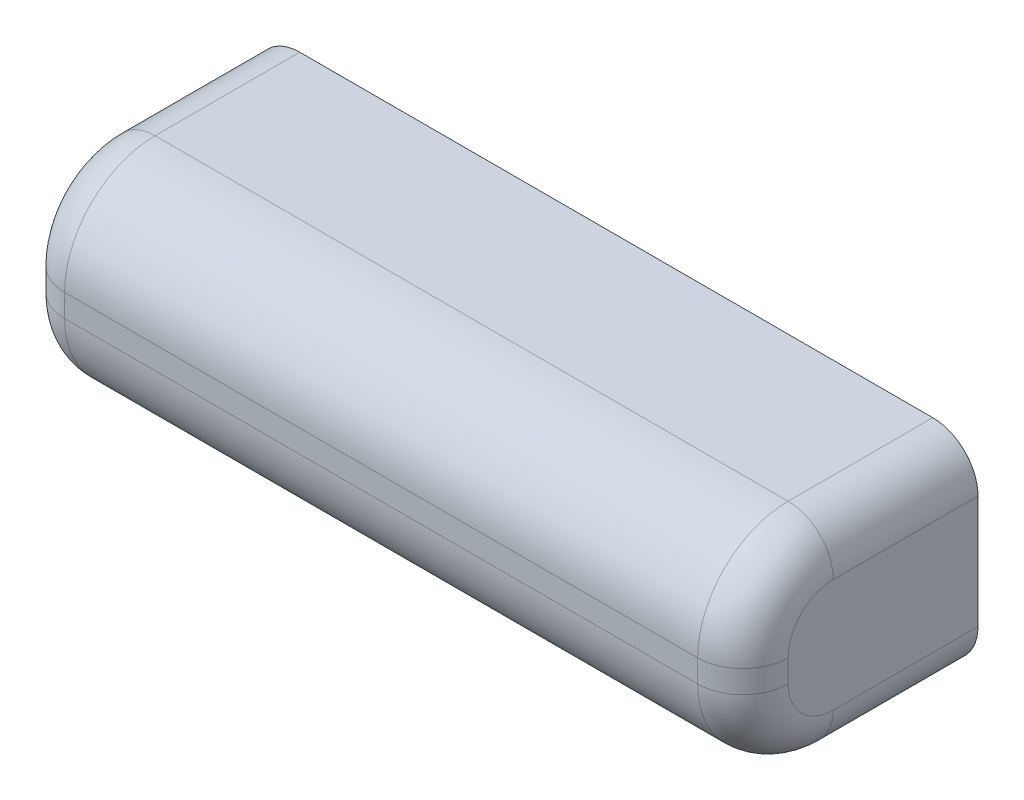
ISO-10303-21;
HEADER;
FILE_DESCRIPTION(('STEP AP214'),'2;1');
FILE_NAME('part.step','',(''),(''),'','','');
FILE_SCHEMA(('AUTOMOTIVE_DESIGN { 1 0 10303 214 1 1 1 1 }'));
ENDSEC;
DATA;
#1=APPLICATION_CONTEXT('core data for automotive mechanical design processes');
#2=APPLICATION_PROTOCOL_DEFINITION('international standard','automotive_design',2000,#1);
#3=PRODUCT_CONTEXT('',#1,'mechanical');
#4=PRODUCT('Part','Part','',(#3));
#5=PRODUCT_RELATED_PRODUCT_CATEGORY('part','',(#4));
#6=PRODUCT_DEFINITION_FORMATION('','',#4);
#7=PRODUCT_DEFINITION_CONTEXT('part definition',#1,'design');
#8=PRODUCT_DEFINITION('design','',#6,#7);
#9=PRODUCT_DEFINITION_SHAPE('','',#8);
#10=(LENGTH_UNIT() NAMED_UNIT(*) SI_UNIT(.MILLI.,.METRE.));
#11=(NAMED_UNIT(*) PLANE_ANGLE_UNIT() SI_UNIT($,.RADIAN.));
#12=(NAMED_UNIT(*) SI_UNIT($,.STERADIAN.) SOLID_ANGLE_UNIT());
#13=UNCERTAINTY_MEASURE_WITH_UNIT(LENGTH_MEASURE(1.E-05),#10,'distance_accuracy_value','');
#14=(GEOMETRIC_REPRESENTATION_CONTEXT(3) GLOBAL_UNCERTAINTY_ASSIGNED_CONTEXT((#13)) GLOBAL_UNIT_ASSIGNED_CONTEXT((#10,
#11,#12)) REPRESENTATION_CONTEXT('',''));
#15=CARTESIAN_POINT('',(0.,0.,0.));
#16=DIRECTION('',(0.,0.,1.));
#17=DIRECTION('',(1.,0.,0.));
#18=AXIS2_PLACEMENT_3D('',#15,#16,#17);
#19=CARTESIAN_POINT('',(64.,0.,10.));
#20=DIRECTION('',(0.,0.,-1.));
#21=DIRECTION('',(-1.,0.,0.));
#22=AXIS2_PLACEMENT_3D('',#19,#20,#21);
#23=PLANE('',#22);
#24=CARTESIAN_POINT('',(64.,0.,10.));
#25=DIRECTION('',(0.,0.,-1.));
#26=DIRECTION('',(-1.,0.,0.));
#27=AXIS2_PLACEMENT_3D('',#24,#25,#26);
#28=CIRCLE('',#27,15.);
#29=CARTESIAN_POINT('',(49.,0.,10.));
#30=VERTEX_POINT('',#29);
#31=EDGE_CURVE('E238',#30,#30,#28,.T.);
#32=ORIENTED_EDGE('',*,*,#31,.T.);
#33=EDGE_LOOP('',(#32));
#34=FACE_BOUND('',#33,.T.);
#35=ADVANCED_FACE('F38',(#34),#23,.T.);
#36=CARTESIAN_POINT('',(64.,0.,10.));
#37=DIRECTION('',(0.,0.,-1.));
#38=DIRECTION('',(-1.,0.,0.));
#39=AXIS2_PLACEMENT_3D('',#36,#37,#38);
#40=CYLINDRICAL_SURFACE('',#39,15.);
#41=ORIENTED_EDGE('',*,*,#31,.F.);
#42=EDGE_LOOP('',(#41));
#43=FACE_BOUND('',#42,.T.);
#44=CARTESIAN_POINT('',(64.,0.,0.));
#45=DIRECTION('',(0.,0.,-1.));
#46=DIRECTION('',(-1.,0.,0.));
#47=AXIS2_PLACEMENT_3D('',#44,#45,#46);
#48=CIRCLE('',#47,15.);
#49=CARTESIAN_POINT('',(49.,0.,0.));
#50=VERTEX_POINT('',#49);
#51=EDGE_CURVE('E235',#50,#50,#48,.T.);
#52=ORIENTED_EDGE('',*,*,#51,.T.);
#53=EDGE_LOOP('',(#52));
#54=FACE_BOUND('',#53,.T.);
#55=ADVANCED_FACE('F314',(#43,#54),#40,.F.);
#56=CARTESIAN_POINT('',(-64.,0.,10.));
#57=DIRECTION('',(0.,0.,-1.));
#58=DIRECTION('',(-1.,0.,0.));
#59=AXIS2_PLACEMENT_3D('',#56,#57,#58);
#60=PLANE('',#59);
#61=CARTESIAN_POINT('',(-64.,0.,10.));
#62=DIRECTION('',(0.,0.,-1.));
#63=DIRECTION('',(-1.,0.,0.));
#64=AXIS2_PLACEMENT_3D('',#61,#62,#63);
#65=CIRCLE('',#64,15.);
#66=CARTESIAN_POINT('',(-79.,0.,10.));
#67=VERTEX_POINT('',#66);
#68=EDGE_CURVE('E232',#67,#67,#65,.T.);
#69=ORIENTED_EDGE('',*,*,#68,.T.);
#70=EDGE_LOOP('',(#69));
#71=FACE_BOUND('',#70,.T.);
#72=ADVANCED_FACE('F320',(#71),#60,.T.);
#73=CARTESIAN_POINT('',(-64.,0.,10.));
#74=DIRECTION('',(0.,0.,-1.));
#75=DIRECTION('',(-1.,0.,0.));
#76=AXIS2_PLACEMENT_3D('',#73,#74,#75);
#77=CYLINDRICAL_SURFACE('',#76,15.);
#78=ORIENTED_EDGE('',*,*,#68,.F.);
#79=EDGE_LOOP('',(#78));
#80=FACE_BOUND('',#79,.T.);
#81=CARTESIAN_POINT('',(-64.,0.,0.));
#82=DIRECTION('',(0.,0.,-1.));
#83=DIRECTION('',(-1.,0.,0.));
#84=AXIS2_PLACEMENT_3D('',#81,#82,#83);
#85=CIRCLE('',#84,15.);
#86=CARTESIAN_POINT('',(-79.,0.,0.));
#87=VERTEX_POINT('',#86);
#88=EDGE_CURVE('E229',#87,#87,#85,.T.);
#89=ORIENTED_EDGE('',*,*,#88,.T.);
#90=EDGE_LOOP('',(#89));
#91=FACE_BOUND('',#90,.T.);
#92=ADVANCED_FACE('F479',(#80,#91),#77,.F.);
#93=CARTESIAN_POINT('',(80.,22.5,52.));
#94=DIRECTION('',(-1.,0.,0.));
#95=DIRECTION('',(0.,-1.,0.));
#96=AXIS2_PLACEMENT_3D('',#93,#94,#95);
#97=PLANE('',#96);
#98=CARTESIAN_POINT('',(80.,-2.50000000000002,32.));
#99=DIRECTION('',(-1.,0.,0.));
#100=DIRECTION('',(0.,-1.,0.));
#101=AXIS2_PLACEMENT_3D('',#98,#99,#100);
#102=CIRCLE('',#101,10.);
#103=CARTESIAN_POINT('',(80.,-2.50000000000002,42.));
#104=VERTEX_POINT('',#103);
#105=CARTESIAN_POINT('',(80.,-12.5,32.));
#106=VERTEX_POINT('',#105);
#107=EDGE_CURVE('E55',#104,#106,#102,.F.);
#108=ORIENTED_EDGE('',*,*,#107,.T.);
#109=DIRECTION('',(0.,0.,-1.));
#110=VECTOR('',#109,1.);
#111=CARTESIAN_POINT('',(80.,-12.5,52.));
#112=LINE('',#111,#110);
#113=CARTESIAN_POINT('',(80.,-12.5,0.));
#114=VERTEX_POINT('',#113);
#115=EDGE_CURVE('E161',#106,#114,#112,.T.);
#116=ORIENTED_EDGE('',*,*,#115,.T.);
#117=DIRECTION('',(0.,1.,0.));
#118=VECTOR('',#117,1.);
#119=CARTESIAN_POINT('',(80.,22.5,0.));
#120=LINE('',#119,#118);
#121=CARTESIAN_POINT('',(80.,12.5,0.));
#122=VERTEX_POINT('',#121);
#123=EDGE_CURVE('E217',#114,#122,#120,.T.);
#124=ORIENTED_EDGE('',*,*,#123,.T.);
#125=DIRECTION('',(0.,0.,-1.));
#126=VECTOR('',#125,1.);
#127=CARTESIAN_POINT('',(80.,12.5,52.));
#128=LINE('',#127,#126);
#129=CARTESIAN_POINT('',(80.,12.5,32.));
#130=VERTEX_POINT('',#129);
#131=EDGE_CURVE('E274',#122,#130,#128,.F.);
#132=ORIENTED_EDGE('',*,*,#131,.T.);
#133=CARTESIAN_POINT('',(80.,2.49999999999999,32.));
#134=DIRECTION('',(-1.,0.,0.));
#135=DIRECTION('',(0.,-1.,0.));
#136=AXIS2_PLACEMENT_3D('',#133,#134,#135);
#137=CIRCLE('',#136,10.);
#138=CARTESIAN_POINT('',(80.,2.49999999999999,42.));
#139=VERTEX_POINT('',#138);
#140=EDGE_CURVE('E276',#130,#139,#137,.F.);
#141=ORIENTED_EDGE('',*,*,#140,.T.);
#142=DIRECTION('',(0.,1.,0.));
#143=VECTOR('',#142,1.);
#144=CARTESIAN_POINT('',(80.,-2.50000000000001,42.));
#145=LINE('',#144,#143);
#146=EDGE_CURVE('E60',#139,#104,#145,.F.);
#147=ORIENTED_EDGE('',*,*,#146,.T.);
#148=EDGE_LOOP('',(#108,#116,#124,#132,#141,#147));
#149=FACE_BOUND('',#148,.T.);
#150=ADVANCED_FACE('F295',(#149),#97,.F.);
#151=CARTESIAN_POINT('',(-80.,22.5,52.));
#152=DIRECTION('',(0.,-1.,0.));
#153=DIRECTION('',(0.,0.,-1.));
#154=AXIS2_PLACEMENT_3D('',#151,#152,#153);
#155=PLANE('',#154);
#156=DIRECTION('',(-1.,0.,0.));
#157=VECTOR('',#156,1.);
#158=CARTESIAN_POINT('',(-80.,22.5,0.));
#159=LINE('',#158,#157);
#160=CARTESIAN_POINT('',(70.,22.5,0.));
#161=VERTEX_POINT('',#160);
#162=CARTESIAN_POINT('',(-70.,22.5,0.));
#163=VERTEX_POINT('',#162);
#164=EDGE_CURVE('E222',#161,#163,#159,.T.);
#165=ORIENTED_EDGE('',*,*,#164,.T.);
#166=DIRECTION('',(0.,0.,-1.));
#167=VECTOR('',#166,1.);
#168=CARTESIAN_POINT('',(-70.,22.5,52.));
#169=LINE('',#168,#167);
#170=CARTESIAN_POINT('',(-70.,22.5,32.));
#171=VERTEX_POINT('',#170);
#172=EDGE_CURVE('E11',#163,#171,#169,.F.);
#173=ORIENTED_EDGE('',*,*,#172,.T.);
#174=DIRECTION('',(-1.,0.,0.));
#175=VECTOR('',#174,1.);
#176=CARTESIAN_POINT('',(80.,22.5,32.));
#177=LINE('',#176,#175);
#178=CARTESIAN_POINT('',(70.,22.5,32.));
#179=VERTEX_POINT('',#178);
#180=EDGE_CURVE('E140',#171,#179,#177,.F.);
#181=ORIENTED_EDGE('',*,*,#180,.T.);
#182=DIRECTION('',(0.,0.,-1.));
#183=VECTOR('',#182,1.);
#184=CARTESIAN_POINT('',(70.,22.5,52.));
#185=LINE('',#184,#183);
#186=EDGE_CURVE('E47',#179,#161,#185,.T.);
#187=ORIENTED_EDGE('',*,*,#186,.T.);
#188=EDGE_LOOP('',(#165,#173,#181,#187));
#189=FACE_BOUND('',#188,.T.);
#190=ADVANCED_FACE('F283',(#189),#155,.F.);
#191=CARTESIAN_POINT('',(-80.,22.5,52.));
#192=DIRECTION('',(1.,0.,0.));
#193=DIRECTION('',(0.,0.,-1.));
#194=AXIS2_PLACEMENT_3D('',#191,#192,#193);
#195=PLANE('',#194);
#196=DIRECTION('',(0.,-1.,0.));
#197=VECTOR('',#196,1.);
#198=CARTESIAN_POINT('',(-80.,22.5,0.));
#199=LINE('',#198,#197);
#200=CARTESIAN_POINT('',(-80.,12.5,0.));
#201=VERTEX_POINT('',#200);
#202=CARTESIAN_POINT('',(-80.,-12.5,0.));
#203=VERTEX_POINT('',#202);
#204=EDGE_CURVE('E225',#201,#203,#199,.T.);
#205=ORIENTED_EDGE('',*,*,#204,.T.);
#206=DIRECTION('',(0.,0.,-1.));
#207=VECTOR('',#206,1.);
#208=CARTESIAN_POINT('',(-80.,-12.5,52.));
#209=LINE('',#208,#207);
#210=CARTESIAN_POINT('',(-80.,-12.5,32.));
#211=VERTEX_POINT('',#210);
#212=EDGE_CURVE('E158',#203,#211,#209,.F.);
#213=ORIENTED_EDGE('',*,*,#212,.T.);
#214=CARTESIAN_POINT('',(-80.,-2.50000000000001,32.));
#215=DIRECTION('',(1.,0.,0.));
#216=DIRECTION('',(0.,0.,-1.));
#217=AXIS2_PLACEMENT_3D('',#214,#215,#216);
#218=CIRCLE('',#217,10.);
#219=CARTESIAN_POINT('',(-80.,-2.50000000000001,42.));
#220=VERTEX_POINT('',#219);
#221=EDGE_CURVE('E262',#211,#220,#218,.F.);
#222=ORIENTED_EDGE('',*,*,#221,.T.);
#223=DIRECTION('',(0.,-1.,0.));
#224=VECTOR('',#223,1.);
#225=CARTESIAN_POINT('',(-80.,2.50000000000001,42.));
#226=LINE('',#225,#224);
#227=CARTESIAN_POINT('',(-80.,2.5,42.));
#228=VERTEX_POINT('',#227);
#229=EDGE_CURVE('E260',#220,#228,#226,.F.);
#230=ORIENTED_EDGE('',*,*,#229,.T.);
#231=CARTESIAN_POINT('',(-80.,2.5,32.));
#232=DIRECTION('',(1.,0.,0.));
#233=DIRECTION('',(0.,0.,-1.));
#234=AXIS2_PLACEMENT_3D('',#231,#232,#233);
#235=CIRCLE('',#234,10.);
#236=CARTESIAN_POINT('',(-80.,12.5,32.));
#237=VERTEX_POINT('',#236);
#238=EDGE_CURVE('E258',#228,#237,#235,.F.);
#239=ORIENTED_EDGE('',*,*,#238,.T.);
#240=DIRECTION('',(0.,0.,-1.));
#241=VECTOR('',#240,1.);
#242=CARTESIAN_POINT('',(-80.,12.5,52.));
#243=LINE('',#242,#241);
#244=EDGE_CURVE('E256',#237,#201,#243,.T.);
#245=ORIENTED_EDGE('',*,*,#244,.T.);
#246=EDGE_LOOP('',(#205,#213,#222,#230,#239,#245));
#247=FACE_BOUND('',#246,.T.);
#248=ADVANCED_FACE('F297',(#247),#195,.F.);
#249=CARTESIAN_POINT('',(-80.,-22.5,52.));
#250=DIRECTION('',(0.,1.,0.));
#251=DIRECTION('',(0.,0.,1.));
#252=AXIS2_PLACEMENT_3D('',#249,#250,#251);
#253=PLANE('',#252);
#254=DIRECTION('',(1.,0.,0.));
#255=VECTOR('',#254,1.);
#256=CARTESIAN_POINT('',(-80.,-22.5,32.));
#257=LINE('',#256,#255);
#258=CARTESIAN_POINT('',(70.,-22.5,32.));
#259=VERTEX_POINT('',#258);
#260=CARTESIAN_POINT('',(-70.,-22.5,32.));
#261=VERTEX_POINT('',#260);
#262=EDGE_CURVE('E133',#259,#261,#257,.F.);
#263=ORIENTED_EDGE('',*,*,#262,.T.);
#264=DIRECTION('',(0.,0.,-1.));
#265=VECTOR('',#264,1.);
#266=CARTESIAN_POINT('',(-70.,-22.5,52.));
#267=LINE('',#266,#265);
#268=CARTESIAN_POINT('',(-70.,-22.5,0.));
#269=VERTEX_POINT('',#268);
#270=EDGE_CURVE('E139',#261,#269,#267,.T.);
#271=ORIENTED_EDGE('',*,*,#270,.T.);
#272=DIRECTION('',(1.,0.,0.));
#273=VECTOR('',#272,1.);
#274=CARTESIAN_POINT('',(-80.,-22.5,0.));
#275=LINE('',#274,#273);
#276=CARTESIAN_POINT('',(70.,-22.5,0.));
#277=VERTEX_POINT('',#276);
#278=EDGE_CURVE('E136',#269,#277,#275,.T.);
#279=ORIENTED_EDGE('',*,*,#278,.T.);
#280=DIRECTION('',(0.,0.,-1.));
#281=VECTOR('',#280,1.);
#282=CARTESIAN_POINT('',(70.,-22.5,52.));
#283=LINE('',#282,#281);
#284=EDGE_CURVE('E129',#277,#259,#283,.F.);
#285=ORIENTED_EDGE('',*,*,#284,.T.);
#286=EDGE_LOOP('',(#263,#271,#279,#285));
#287=FACE_BOUND('',#286,.T.);
#288=ADVANCED_FACE('F131',(#287),#253,.F.);
#289=CARTESIAN_POINT('',(0.,0.,52.));
#290=DIRECTION('',(0.,0.,1.));
#291=DIRECTION('',(1.,0.,0.));
#292=AXIS2_PLACEMENT_3D('',#289,#290,#291);
#293=PLANE('',#292);
#294=DIRECTION('',(-1.,0.,0.));
#295=VECTOR('',#294,1.);
#296=CARTESIAN_POINT('',(-80.,2.5,52.));
#297=LINE('',#296,#295);
#298=CARTESIAN_POINT('',(70.,2.5,52.));
#299=VERTEX_POINT('',#298);
#300=CARTESIAN_POINT('',(-70.,2.5,52.));
#301=VERTEX_POINT('',#300);
#302=EDGE_CURVE('E241',#299,#301,#297,.T.);
#303=ORIENTED_EDGE('',*,*,#302,.T.);
#304=DIRECTION('',(0.,-1.,0.));
#305=VECTOR('',#304,1.);
#306=CARTESIAN_POINT('',(-70.,-2.50000000000001,52.));
#307=LINE('',#306,#305);
#308=CARTESIAN_POINT('',(-70.,-2.50000000000001,52.));
#309=VERTEX_POINT('',#308);
#310=EDGE_CURVE('E268',#301,#309,#307,.T.);
#311=ORIENTED_EDGE('',*,*,#310,.T.);
#312=DIRECTION('',(1.,0.,0.));
#313=VECTOR('',#312,1.);
#314=CARTESIAN_POINT('',(80.,-2.50000000000001,52.));
#315=LINE('',#314,#313);
#316=CARTESIAN_POINT('',(70.,-2.50000000000001,52.));
#317=VERTEX_POINT('',#316);
#318=EDGE_CURVE('E150',#309,#317,#315,.T.);
#319=ORIENTED_EDGE('',*,*,#318,.T.);
#320=DIRECTION('',(0.,1.,0.));
#321=VECTOR('',#320,1.);
#322=CARTESIAN_POINT('',(70.,2.50000000000001,52.));
#323=LINE('',#322,#321);
#324=EDGE_CURVE('E266',#317,#299,#323,.T.);
#325=ORIENTED_EDGE('',*,*,#324,.T.);
#326=EDGE_LOOP('',(#303,#311,#319,#325));
#327=FACE_BOUND('',#326,.T.);
#328=ADVANCED_FACE('F340',(#327),#293,.T.);
#329=CARTESIAN_POINT('',(0.,0.,0.));
#330=DIRECTION('',(0.,0.,1.));
#331=DIRECTION('',(1.,0.,0.));
#332=AXIS2_PLACEMENT_3D('',#329,#330,#331);
#333=PLANE('',#332);
#334=CARTESIAN_POINT('',(32.,0.,0.));
#335=DIRECTION('',(0.,0.,-1.));
#336=DIRECTION('',(-1.,0.,0.));
#337=AXIS2_PLACEMENT_3D('',#334,#335,#336);
#338=CIRCLE('',#337,15.);
#339=CARTESIAN_POINT('',(17.,0.,0.));
#340=VERTEX_POINT('',#339);
#341=EDGE_CURVE('E194',#340,#340,#338,.T.);
#342=ORIENTED_EDGE('',*,*,#341,.F.);
#343=EDGE_LOOP('',(#342));
#344=FACE_BOUND('',#343,.T.);
#345=CARTESIAN_POINT('',(-32.,0.,0.));
#346=DIRECTION('',(0.,0.,-1.));
#347=DIRECTION('',(-1.,0.,0.));
#348=AXIS2_PLACEMENT_3D('',#345,#346,#347);
#349=CIRCLE('',#348,15.);
#350=CARTESIAN_POINT('',(-47.,0.,0.));
#351=VERTEX_POINT('',#350);
#352=EDGE_CURVE('E205',#351,#351,#349,.T.);
#353=ORIENTED_EDGE('',*,*,#352,.F.);
#354=EDGE_LOOP('',(#353));
#355=FACE_BOUND('',#354,.T.);
#356=CARTESIAN_POINT('',(0.,0.,0.));
#357=DIRECTION('',(0.,0.,-1.));
#358=DIRECTION('',(-1.,0.,0.));
#359=AXIS2_PLACEMENT_3D('',#356,#357,#358);
#360=CIRCLE('',#359,15.);
#361=CARTESIAN_POINT('',(-15.,0.,0.));
#362=VERTEX_POINT('',#361);
#363=EDGE_CURVE('E213',#362,#362,#360,.T.);
#364=ORIENTED_EDGE('',*,*,#363,.F.);
#365=EDGE_LOOP('',(#364));
#366=FACE_BOUND('',#365,.T.);
#367=ORIENTED_EDGE('',*,*,#278,.F.);
#368=CARTESIAN_POINT('',(-70.,-12.5,0.));
#369=DIRECTION('',(0.,0.,1.));
#370=DIRECTION('',(1.,0.,0.));
#371=AXIS2_PLACEMENT_3D('',#368,#369,#370);
#372=CIRCLE('',#371,10.);
#373=EDGE_CURVE('E254',#269,#203,#372,.F.);
#374=ORIENTED_EDGE('',*,*,#373,.T.);
#375=ORIENTED_EDGE('',*,*,#204,.F.);
#376=CARTESIAN_POINT('',(-70.,12.5,0.));
#377=DIRECTION('',(0.,0.,1.));
#378=DIRECTION('',(1.,0.,0.));
#379=AXIS2_PLACEMENT_3D('',#376,#377,#378);
#380=CIRCLE('',#379,10.);
#381=EDGE_CURVE('E250',#201,#163,#380,.F.);
#382=ORIENTED_EDGE('',*,*,#381,.T.);
#383=ORIENTED_EDGE('',*,*,#164,.F.);
#384=CARTESIAN_POINT('',(70.,12.5,0.));
#385=DIRECTION('',(0.,0.,1.));
#386=DIRECTION('',(1.,0.,0.));
#387=AXIS2_PLACEMENT_3D('',#384,#385,#386);
#388=CIRCLE('',#387,10.);
#389=EDGE_CURVE('E248',#161,#122,#388,.F.);
#390=ORIENTED_EDGE('',*,*,#389,.T.);
#391=ORIENTED_EDGE('',*,*,#123,.F.);
#392=CARTESIAN_POINT('',(70.,-12.5,0.));
#393=DIRECTION('',(0.,0.,1.));
#394=DIRECTION('',(1.,0.,0.));
#395=AXIS2_PLACEMENT_3D('',#392,#393,#394);
#396=CIRCLE('',#395,10.);
#397=EDGE_CURVE('E252',#114,#277,#396,.F.);
#398=ORIENTED_EDGE('',*,*,#397,.T.);
#399=EDGE_LOOP('',(#367,#374,#375,#382,#383,#390,#391,#398));
#400=FACE_BOUND('',#399,.T.);
#401=ORIENTED_EDGE('',*,*,#88,.F.);
#402=EDGE_LOOP('',(#401));
#403=FACE_BOUND('',#402,.T.);
#404=ORIENTED_EDGE('',*,*,#51,.F.);
#405=EDGE_LOOP('',(#404));
#406=FACE_BOUND('',#405,.T.);
#407=ADVANCED_FACE('F289',(#344,#355,#366,#400,#403,#406),#333,.F.);
#408=CARTESIAN_POINT('',(0.,0.,10.));
#409=DIRECTION('',(0.,0.,-1.));
#410=DIRECTION('',(-1.,0.,0.));
#411=AXIS2_PLACEMENT_3D('',#408,#409,#410);
#412=CYLINDRICAL_SURFACE('',#411,15.);
#413=CARTESIAN_POINT('',(0.,0.,10.));
#414=DIRECTION('',(0.,0.,-1.));
#415=DIRECTION('',(-1.,0.,0.));
#416=AXIS2_PLACEMENT_3D('',#413,#414,#415);
#417=CIRCLE('',#416,15.);
#418=CARTESIAN_POINT('',(-15.,0.,10.));
#419=VERTEX_POINT('',#418);
#420=EDGE_CURVE('E214',#419,#419,#417,.T.);
#421=ORIENTED_EDGE('',*,*,#420,.F.);
#422=EDGE_LOOP('',(#421));
#423=FACE_BOUND('',#422,.T.);
#424=ORIENTED_EDGE('',*,*,#363,.T.);
#425=EDGE_LOOP('',(#424));
#426=FACE_BOUND('',#425,.T.);
#427=ADVANCED_FACE('F500',(#423,#426),#412,.F.);
#428=CARTESIAN_POINT('',(0.,0.,10.));
#429=DIRECTION('',(0.,0.,-1.));
#430=DIRECTION('',(-1.,0.,0.));
#431=AXIS2_PLACEMENT_3D('',#428,#429,#430);
#432=PLANE('',#431);
#433=ORIENTED_EDGE('',*,*,#420,.T.);
#434=EDGE_LOOP('',(#433));
#435=FACE_BOUND('',#434,.T.);
#436=ADVANCED_FACE('F474',(#435),#432,.T.);
#437=CARTESIAN_POINT('',(-32.,0.,10.));
#438=DIRECTION('',(0.,0.,-1.));
#439=DIRECTION('',(-1.,0.,0.));
#440=AXIS2_PLACEMENT_3D('',#437,#438,#439);
#441=CYLINDRICAL_SURFACE('',#440,15.);
#442=CARTESIAN_POINT('',(-32.,0.,10.));
#443=DIRECTION('',(0.,0.,-1.));
#444=DIRECTION('',(-1.,0.,0.));
#445=AXIS2_PLACEMENT_3D('',#442,#443,#444);
#446=CIRCLE('',#445,15.);
#447=CARTESIAN_POINT('',(-47.,0.,10.));
#448=VERTEX_POINT('',#447);
#449=EDGE_CURVE('E210',#448,#448,#446,.T.);
#450=ORIENTED_EDGE('',*,*,#449,.F.);
#451=EDGE_LOOP('',(#450));
#452=FACE_BOUND('',#451,.T.);
#453=ORIENTED_EDGE('',*,*,#352,.T.);
#454=EDGE_LOOP('',(#453));
#455=FACE_BOUND('',#454,.T.);
#456=ADVANCED_FACE('F464',(#452,#455),#441,.F.);
#457=CARTESIAN_POINT('',(-32.,0.,10.));
#458=DIRECTION('',(0.,0.,-1.));
#459=DIRECTION('',(-1.,0.,0.));
#460=AXIS2_PLACEMENT_3D('',#457,#458,#459);
#461=PLANE('',#460);
#462=ORIENTED_EDGE('',*,*,#449,.T.);
#463=EDGE_LOOP('',(#462));
#464=FACE_BOUND('',#463,.T.);
#465=ADVANCED_FACE('F445',(#464),#461,.T.);
#466=CARTESIAN_POINT('',(32.,0.,10.));
#467=DIRECTION('',(0.,0.,-1.));
#468=DIRECTION('',(-1.,0.,0.));
#469=AXIS2_PLACEMENT_3D('',#466,#467,#468);
#470=CYLINDRICAL_SURFACE('',#469,15.);
#471=CARTESIAN_POINT('',(32.,0.,10.));
#472=DIRECTION('',(0.,0.,-1.));
#473=DIRECTION('',(-1.,0.,0.));
#474=AXIS2_PLACEMENT_3D('',#471,#472,#473);
#475=CIRCLE('',#474,15.);
#476=CARTESIAN_POINT('',(17.,0.,10.));
#477=VERTEX_POINT('',#476);
#478=EDGE_CURVE('E200',#477,#477,#475,.T.);
#479=ORIENTED_EDGE('',*,*,#478,.F.);
#480=EDGE_LOOP('',(#479));
#481=FACE_BOUND('',#480,.T.);
#482=ORIENTED_EDGE('',*,*,#341,.T.);
#483=EDGE_LOOP('',(#482));
#484=FACE_BOUND('',#483,.T.);
#485=ADVANCED_FACE('F434',(#481,#484),#470,.F.);
#486=CARTESIAN_POINT('',(32.,0.,10.));
#487=DIRECTION('',(0.,0.,-1.));
#488=DIRECTION('',(-1.,0.,0.));
#489=AXIS2_PLACEMENT_3D('',#486,#487,#488);
#490=PLANE('',#489);
#491=ORIENTED_EDGE('',*,*,#478,.T.);
#492=EDGE_LOOP('',(#491));
#493=FACE_BOUND('',#492,.T.);
#494=ADVANCED_FACE('F327',(#493),#490,.T.);
#495=CARTESIAN_POINT('',(0.,-2.50000000000001,32.));
#496=DIRECTION('',(-1.,0.,0.));
#497=DIRECTION('',(0.,0.,1.));
#498=AXIS2_PLACEMENT_3D('',#495,#496,#497);
#499=CYLINDRICAL_SURFACE('',#498,20.);
#500=ORIENTED_EDGE('',*,*,#318,.F.);
#501=CARTESIAN_POINT('',(-70.,-2.50000000000001,32.));
#502=DIRECTION('',(1.,0.,0.));
#503=DIRECTION('',(0.,0.,-1.));
#504=AXIS2_PLACEMENT_3D('',#501,#502,#503);
#505=CIRCLE('',#504,20.);
#506=EDGE_CURVE('E149',#309,#261,#505,.T.);
#507=ORIENTED_EDGE('',*,*,#506,.T.);
#508=ORIENTED_EDGE('',*,*,#262,.F.);
#509=CARTESIAN_POINT('',(70.,-2.50000000000001,32.));
#510=DIRECTION('',(-1.,0.,0.));
#511=DIRECTION('',(0.,-1.,0.));
#512=AXIS2_PLACEMENT_3D('',#509,#510,#511);
#513=CIRCLE('',#512,20.);
#514=EDGE_CURVE('E146',#259,#317,#513,.T.);
#515=ORIENTED_EDGE('',*,*,#514,.T.);
#516=EDGE_LOOP('',(#500,#507,#508,#515));
#517=FACE_BOUND('',#516,.T.);
#518=ADVANCED_FACE('F145',(#517),#499,.T.);
#519=CARTESIAN_POINT('',(0.,2.5,32.));
#520=DIRECTION('',(1.,0.,0.));
#521=DIRECTION('',(0.,0.,-1.));
#522=AXIS2_PLACEMENT_3D('',#519,#520,#521);
#523=CYLINDRICAL_SURFACE('',#522,20.);
#524=ORIENTED_EDGE('',*,*,#180,.F.);
#525=CARTESIAN_POINT('',(-70.,2.5,32.));
#526=DIRECTION('',(1.,0.,0.));
#527=DIRECTION('',(0.,0.,-1.));
#528=AXIS2_PLACEMENT_3D('',#525,#526,#527);
#529=CIRCLE('',#528,20.);
#530=EDGE_CURVE('E272',#171,#301,#529,.T.);
#531=ORIENTED_EDGE('',*,*,#530,.T.);
#532=ORIENTED_EDGE('',*,*,#302,.F.);
#533=CARTESIAN_POINT('',(70.,2.5,32.));
#534=DIRECTION('',(-1.,0.,0.));
#535=DIRECTION('',(0.,-1.,0.));
#536=AXIS2_PLACEMENT_3D('',#533,#534,#535);
#537=CIRCLE('',#536,20.);
#538=EDGE_CURVE('E270',#299,#179,#537,.T.);
#539=ORIENTED_EDGE('',*,*,#538,.T.);
#540=EDGE_LOOP('',(#524,#531,#532,#539));
#541=FACE_BOUND('',#540,.T.);
#542=ADVANCED_FACE('F326',(#541),#523,.T.);
#543=CARTESIAN_POINT('',(-70.,12.5,52.));
#544=DIRECTION('',(0.,0.,-1.));
#545=DIRECTION('',(-1.,0.,0.));
#546=AXIS2_PLACEMENT_3D('',#543,#544,#545);
#547=CYLINDRICAL_SURFACE('',#546,10.);
#548=ORIENTED_EDGE('',*,*,#381,.F.);
#549=ORIENTED_EDGE('',*,*,#244,.F.);
#550=CARTESIAN_POINT('',(-70.,12.5,32.));
#551=DIRECTION('',(0.,0.,1.));
#552=DIRECTION('',(1.,0.,0.));
#553=AXIS2_PLACEMENT_3D('',#550,#551,#552);
#554=CIRCLE('',#553,10.);
#555=EDGE_CURVE('E166',#171,#237,#554,.T.);
#556=ORIENTED_EDGE('',*,*,#555,.F.);
#557=ORIENTED_EDGE('',*,*,#172,.F.);
#558=EDGE_LOOP('',(#548,#549,#556,#557));
#559=FACE_BOUND('',#558,.T.);
#560=ADVANCED_FACE('F329',(#559),#547,.T.);
#561=CARTESIAN_POINT('',(-70.,2.5,32.));
#562=DIRECTION('',(1.,0.,0.));
#563=DIRECTION('',(0.,0.,-1.));
#564=AXIS2_PLACEMENT_3D('',#561,#562,#563);
#565=DEGENERATE_TOROIDAL_SURFACE('',#564,10.,10.,.T.);
#566=ORIENTED_EDGE('',*,*,#555,.T.);
#567=ORIENTED_EDGE('',*,*,#238,.F.);
#568=CARTESIAN_POINT('',(-70.,2.5,42.));
#569=DIRECTION('',(0.,-1.,0.));
#570=DIRECTION('',(0.,0.,-1.));
#571=AXIS2_PLACEMENT_3D('',#568,#569,#570);
#572=CIRCLE('',#571,10.);
#573=EDGE_CURVE('E185',#301,#228,#572,.T.);
#574=ORIENTED_EDGE('',*,*,#573,.F.);
#575=ORIENTED_EDGE('',*,*,#530,.F.);
#576=EDGE_LOOP('',(#566,#567,#574,#575));
#577=FACE_BOUND('',#576,.T.);
#578=ADVANCED_FACE('F334',(#577),#565,.T.);
#579=CARTESIAN_POINT('',(-70.,0.,42.));
#580=DIRECTION('',(0.,1.,0.));
#581=DIRECTION('',(0.,0.,1.));
#582=AXIS2_PLACEMENT_3D('',#579,#580,#581);
#583=CYLINDRICAL_SURFACE('',#582,10.);
#584=ORIENTED_EDGE('',*,*,#573,.T.);
#585=ORIENTED_EDGE('',*,*,#229,.F.);
#586=CARTESIAN_POINT('',(-70.,-2.50000000000001,42.));
#587=DIRECTION('',(0.,-1.,0.));
#588=DIRECTION('',(0.,0.,-1.));
#589=AXIS2_PLACEMENT_3D('',#586,#587,#588);
#590=CIRCLE('',#589,10.);
#591=EDGE_CURVE('E179',#309,#220,#590,.T.);
#592=ORIENTED_EDGE('',*,*,#591,.F.);
#593=ORIENTED_EDGE('',*,*,#310,.F.);
#594=EDGE_LOOP('',(#584,#585,#592,#593));
#595=FACE_BOUND('',#594,.T.);
#596=ADVANCED_FACE('F309',(#595),#583,.T.);
#597=CARTESIAN_POINT('',(-70.,-2.50000000000001,32.));
#598=DIRECTION('',(1.,0.,0.));
#599=DIRECTION('',(0.,0.,-1.));
#600=AXIS2_PLACEMENT_3D('',#597,#598,#599);
#601=DEGENERATE_TOROIDAL_SURFACE('',#600,10.,10.,.T.);
#602=ORIENTED_EDGE('',*,*,#591,.T.);
#603=ORIENTED_EDGE('',*,*,#221,.F.);
#604=CARTESIAN_POINT('',(-70.,-12.5,32.));
#605=DIRECTION('',(0.,0.,-1.));
#606=DIRECTION('',(-1.,0.,0.));
#607=AXIS2_PLACEMENT_3D('',#604,#605,#606);
#608=CIRCLE('',#607,10.);
#609=EDGE_CURVE('E173',#261,#211,#608,.T.);
#610=ORIENTED_EDGE('',*,*,#609,.F.);
#611=ORIENTED_EDGE('',*,*,#506,.F.);
#612=EDGE_LOOP('',(#602,#603,#610,#611));
#613=FACE_BOUND('',#612,.T.);
#614=ADVANCED_FACE('F302',(#613),#601,.T.);
#615=CARTESIAN_POINT('',(-70.,-12.5,52.));
#616=DIRECTION('',(0.,0.,-1.));
#617=DIRECTION('',(-1.,0.,0.));
#618=AXIS2_PLACEMENT_3D('',#615,#616,#617);
#619=CYLINDRICAL_SURFACE('',#618,10.);
#620=ORIENTED_EDGE('',*,*,#609,.T.);
#621=ORIENTED_EDGE('',*,*,#212,.F.);
#622=ORIENTED_EDGE('',*,*,#373,.F.);
#623=ORIENTED_EDGE('',*,*,#270,.F.);
#624=EDGE_LOOP('',(#620,#621,#622,#623));
#625=FACE_BOUND('',#624,.T.);
#626=ADVANCED_FACE('F300',(#625),#619,.T.);
#627=CARTESIAN_POINT('',(70.,12.5,52.));
#628=DIRECTION('',(0.,0.,-1.));
#629=DIRECTION('',(-1.,0.,0.));
#630=AXIS2_PLACEMENT_3D('',#627,#628,#629);
#631=CYLINDRICAL_SURFACE('',#630,10.);
#632=ORIENTED_EDGE('',*,*,#389,.F.);
#633=ORIENTED_EDGE('',*,*,#186,.F.);
#634=CARTESIAN_POINT('',(70.,12.5,32.));
#635=DIRECTION('',(0.,0.,1.));
#636=DIRECTION('',(1.,0.,0.));
#637=AXIS2_PLACEMENT_3D('',#634,#635,#636);
#638=CIRCLE('',#637,10.);
#639=EDGE_CURVE('E42',#130,#179,#638,.T.);
#640=ORIENTED_EDGE('',*,*,#639,.F.);
#641=ORIENTED_EDGE('',*,*,#131,.F.);
#642=EDGE_LOOP('',(#632,#633,#640,#641));
#643=FACE_BOUND('',#642,.T.);
#644=ADVANCED_FACE('F40',(#643),#631,.T.);
#645=CARTESIAN_POINT('',(70.,2.5,32.));
#646=DIRECTION('',(-1.,0.,0.));
#647=DIRECTION('',(0.,-1.,0.));
#648=AXIS2_PLACEMENT_3D('',#645,#646,#647);
#649=DEGENERATE_TOROIDAL_SURFACE('',#648,10.,10.,.T.);
#650=ORIENTED_EDGE('',*,*,#639,.T.);
#651=ORIENTED_EDGE('',*,*,#538,.F.);
#652=CARTESIAN_POINT('',(70.,2.5,42.));
#653=DIRECTION('',(0.,-1.,0.));
#654=DIRECTION('',(1.,0.,0.));
#655=AXIS2_PLACEMENT_3D('',#652,#653,#654);
#656=CIRCLE('',#655,10.);
#657=EDGE_CURVE('E163',#139,#299,#656,.T.);
#658=ORIENTED_EDGE('',*,*,#657,.F.);
#659=ORIENTED_EDGE('',*,*,#140,.F.);
#660=EDGE_LOOP('',(#650,#651,#658,#659));
#661=FACE_BOUND('',#660,.T.);
#662=ADVANCED_FACE('F308',(#661),#649,.T.);
#663=CARTESIAN_POINT('',(70.,0.,42.));
#664=DIRECTION('',(0.,-1.,0.));
#665=DIRECTION('',(1.,0.,0.));
#666=AXIS2_PLACEMENT_3D('',#663,#664,#665);
#667=CYLINDRICAL_SURFACE('',#666,10.);
#668=ORIENTED_EDGE('',*,*,#657,.T.);
#669=ORIENTED_EDGE('',*,*,#324,.F.);
#670=CARTESIAN_POINT('',(70.,-2.50000000000001,42.));
#671=DIRECTION('',(0.,-1.,0.));
#672=DIRECTION('',(1.,0.,0.));
#673=AXIS2_PLACEMENT_3D('',#670,#671,#672);
#674=CIRCLE('',#673,10.);
#675=EDGE_CURVE('E157',#104,#317,#674,.T.);
#676=ORIENTED_EDGE('',*,*,#675,.F.);
#677=ORIENTED_EDGE('',*,*,#146,.F.);
#678=EDGE_LOOP('',(#668,#669,#676,#677));
#679=FACE_BOUND('',#678,.T.);
#680=ADVANCED_FACE('F341',(#679),#667,.T.);
#681=CARTESIAN_POINT('',(70.,-2.50000000000001,32.));
#682=DIRECTION('',(-1.,0.,0.));
#683=DIRECTION('',(0.,-1.,0.));
#684=AXIS2_PLACEMENT_3D('',#681,#682,#683);
#685=DEGENERATE_TOROIDAL_SURFACE('',#684,10.,10.,.T.);
#686=ORIENTED_EDGE('',*,*,#675,.T.);
#687=ORIENTED_EDGE('',*,*,#514,.F.);
#688=CARTESIAN_POINT('',(70.,-12.5,32.));
#689=DIRECTION('',(0.,0.,-1.));
#690=DIRECTION('',(-1.,0.,0.));
#691=AXIS2_PLACEMENT_3D('',#688,#689,#690);
#692=CIRCLE('',#691,10.);
#693=EDGE_CURVE('E155',#106,#259,#692,.T.);
#694=ORIENTED_EDGE('',*,*,#693,.F.);
#695=ORIENTED_EDGE('',*,*,#107,.F.);
#696=EDGE_LOOP('',(#686,#687,#694,#695));
#697=FACE_BOUND('',#696,.T.);
#698=ADVANCED_FACE('F154',(#697),#685,.T.);
#699=CARTESIAN_POINT('',(70.,-12.5,52.));
#700=DIRECTION('',(0.,0.,-1.));
#701=DIRECTION('',(-1.,0.,0.));
#702=AXIS2_PLACEMENT_3D('',#699,#700,#701);
#703=CYLINDRICAL_SURFACE('',#702,10.);
#704=ORIENTED_EDGE('',*,*,#693,.T.);
#705=ORIENTED_EDGE('',*,*,#284,.F.);
#706=ORIENTED_EDGE('',*,*,#397,.F.);
#707=ORIENTED_EDGE('',*,*,#115,.F.);
#708=EDGE_LOOP('',(#704,#705,#706,#707));
#709=FACE_BOUND('',#708,.T.);
#710=ADVANCED_FACE('F160',(#709),#703,.T.);
#711=CLOSED_SHELL('',(#35,#55,#72,#92,#150,#190,#248,#288,#328,#407,#427,#436,#456,#465,#485,
#494,#518,#542,#560,#578,#596,#614,#626,#644,#662,#680,#698,#710));
#712=MANIFOLD_SOLID_BREP('B2',#711);
#713=ADVANCED_BREP_SHAPE_REPRESENTATION('',(#18,#712),#14);
#714=SHAPE_DEFINITION_REPRESENTATION(#9,#713);
ENDSEC;
END-ISO-10303-21;
